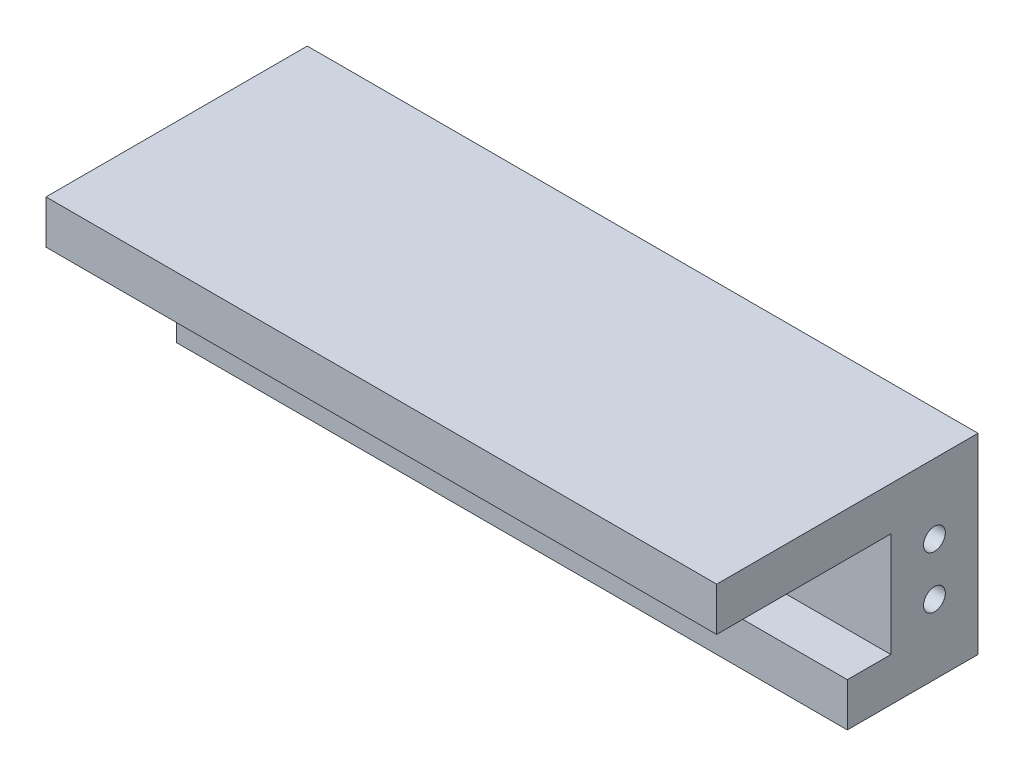
ISO-10303-21;
HEADER;
FILE_DESCRIPTION(('STEP AP214'),'2;1');
FILE_NAME('part.step','',(''),(''),'','','');
FILE_SCHEMA(('AUTOMOTIVE_DESIGN { 1 0 10303 214 1 1 1 1 }'));
ENDSEC;
DATA;
#1=APPLICATION_CONTEXT('core data for automotive mechanical design processes');
#2=APPLICATION_PROTOCOL_DEFINITION('international standard','automotive_design',2000,#1);
#3=PRODUCT_CONTEXT('',#1,'mechanical');
#4=PRODUCT('Part','Part','',(#3));
#5=PRODUCT_RELATED_PRODUCT_CATEGORY('part','',(#4));
#6=PRODUCT_DEFINITION_FORMATION('','',#4);
#7=PRODUCT_DEFINITION_CONTEXT('part definition',#1,'design');
#8=PRODUCT_DEFINITION('design','',#6,#7);
#9=PRODUCT_DEFINITION_SHAPE('','',#8);
#10=(LENGTH_UNIT() NAMED_UNIT(*) SI_UNIT(.MILLI.,.METRE.));
#11=(NAMED_UNIT(*) PLANE_ANGLE_UNIT() SI_UNIT($,.RADIAN.));
#12=(NAMED_UNIT(*) SI_UNIT($,.STERADIAN.) SOLID_ANGLE_UNIT());
#13=UNCERTAINTY_MEASURE_WITH_UNIT(LENGTH_MEASURE(1.E-05),#10,'distance_accuracy_value','');
#14=(GEOMETRIC_REPRESENTATION_CONTEXT(3) GLOBAL_UNCERTAINTY_ASSIGNED_CONTEXT((#13)) GLOBAL_UNIT_ASSIGNED_CONTEXT((#10,
#11,#12)) REPRESENTATION_CONTEXT('',''));
#15=CARTESIAN_POINT('',(0.,0.,0.));
#16=DIRECTION('',(0.,0.,1.));
#17=DIRECTION('',(1.,0.,0.));
#18=AXIS2_PLACEMENT_3D('',#15,#16,#17);
#19=CARTESIAN_POINT('',(0.,0.,10.));
#20=DIRECTION('',(1.,0.,0.));
#21=DIRECTION('',(0.,0.,-1.));
#22=AXIS2_PLACEMENT_3D('',#19,#20,#21);
#23=PLANE('',#22);
#24=CARTESIAN_POINT('',(0.,6.,5.));
#25=DIRECTION('',(-1.,0.,0.));
#26=DIRECTION('',(0.,0.,1.));
#27=AXIS2_PLACEMENT_3D('',#24,#25,#26);
#28=CIRCLE('',#27,1.25);
#29=CARTESIAN_POINT('',(0.,6.,6.25));
#30=VERTEX_POINT('',#29);
#31=EDGE_CURVE('E155',#30,#30,#28,.T.);
#32=ORIENTED_EDGE('',*,*,#31,.F.);
#33=EDGE_LOOP('',(#32));
#34=FACE_BOUND('',#33,.T.);
#35=DIRECTION('',(0.,-1.,0.));
#36=VECTOR('',#35,1.);
#37=CARTESIAN_POINT('',(0.,0.,15.));
#38=LINE('',#37,#36);
#39=CARTESIAN_POINT('',(0.,0.,15.));
#40=VERTEX_POINT('',#39);
#41=CARTESIAN_POINT('',(0.,-5.,15.));
#42=VERTEX_POINT('',#41);
#43=EDGE_CURVE('E49',#40,#42,#38,.T.);
#44=ORIENTED_EDGE('',*,*,#43,.F.);
#45=DIRECTION('',(0.,0.,1.));
#46=VECTOR('',#45,1.);
#47=CARTESIAN_POINT('',(0.,0.,0.));
#48=LINE('',#47,#46);
#49=CARTESIAN_POINT('',(0.,0.,10.));
#50=VERTEX_POINT('',#49);
#51=EDGE_CURVE('E196',#50,#40,#48,.T.);
#52=ORIENTED_EDGE('',*,*,#51,.F.);
#53=DIRECTION('',(0.,-1.,0.));
#54=VECTOR('',#53,1.);
#55=CARTESIAN_POINT('',(0.,0.,10.));
#56=LINE('',#55,#54);
#57=CARTESIAN_POINT('',(0.,12.,10.));
#58=VERTEX_POINT('',#57);
#59=EDGE_CURVE('E223',#58,#50,#56,.T.);
#60=ORIENTED_EDGE('',*,*,#59,.F.);
#61=DIRECTION('',(0.,0.,1.));
#62=VECTOR('',#61,1.);
#63=CARTESIAN_POINT('',(0.,12.,0.));
#64=LINE('',#63,#62);
#65=CARTESIAN_POINT('',(0.,12.,30.));
#66=VERTEX_POINT('',#65);
#67=EDGE_CURVE('E135',#58,#66,#64,.T.);
#68=ORIENTED_EDGE('',*,*,#67,.T.);
#69=DIRECTION('',(0.,-1.,0.));
#70=VECTOR('',#69,1.);
#71=CARTESIAN_POINT('',(0.,12.,30.));
#72=LINE('',#71,#70);
#73=CARTESIAN_POINT('',(0.,17.,30.));
#74=VERTEX_POINT('',#73);
#75=EDGE_CURVE('E145',#74,#66,#72,.T.);
#76=ORIENTED_EDGE('',*,*,#75,.F.);
#77=DIRECTION('',(0.,0.,1.));
#78=VECTOR('',#77,1.);
#79=CARTESIAN_POINT('',(0.,17.,0.));
#80=LINE('',#79,#78);
#81=CARTESIAN_POINT('',(0.,17.,0.));
#82=VERTEX_POINT('',#81);
#83=EDGE_CURVE('E141',#82,#74,#80,.T.);
#84=ORIENTED_EDGE('',*,*,#83,.F.);
#85=DIRECTION('',(0.,-1.,0.));
#86=VECTOR('',#85,1.);
#87=CARTESIAN_POINT('',(0.,0.,0.));
#88=LINE('',#87,#86);
#89=CARTESIAN_POINT('',(0.,-5.,0.));
#90=VERTEX_POINT('',#89);
#91=EDGE_CURVE('E214',#82,#90,#88,.T.);
#92=ORIENTED_EDGE('',*,*,#91,.T.);
#93=DIRECTION('',(0.,0.,1.));
#94=VECTOR('',#93,1.);
#95=CARTESIAN_POINT('',(0.,-5.,0.));
#96=LINE('',#95,#94);
#97=EDGE_CURVE('E195',#90,#42,#96,.T.);
#98=ORIENTED_EDGE('',*,*,#97,.T.);
#99=EDGE_LOOP('',(#44,#52,#60,#68,#76,#84,#92,#98));
#100=FACE_BOUND('',#99,.T.);
#101=ADVANCED_FACE('F33',(#34,#100),#23,.F.);
#102=CARTESIAN_POINT('',(77.,0.,10.));
#103=DIRECTION('',(-1.,0.,0.));
#104=DIRECTION('',(0.,0.,1.));
#105=AXIS2_PLACEMENT_3D('',#102,#103,#104);
#106=PLANE('',#105);
#107=CARTESIAN_POINT('',(77.,9.,5.));
#108=DIRECTION('',(1.,0.,0.));
#109=DIRECTION('',(0.,0.,-1.));
#110=AXIS2_PLACEMENT_3D('',#107,#108,#109);
#111=CIRCLE('',#110,1.25);
#112=CARTESIAN_POINT('',(77.,9.,3.75));
#113=VERTEX_POINT('',#112);
#114=EDGE_CURVE('E218',#113,#113,#111,.T.);
#115=ORIENTED_EDGE('',*,*,#114,.F.);
#116=EDGE_LOOP('',(#115));
#117=FACE_BOUND('',#116,.T.);
#118=CARTESIAN_POINT('',(77.,3.,5.));
#119=DIRECTION('',(1.,0.,0.));
#120=DIRECTION('',(0.,0.,-1.));
#121=AXIS2_PLACEMENT_3D('',#118,#119,#120);
#122=CIRCLE('',#121,1.25);
#123=CARTESIAN_POINT('',(77.,3.,3.75));
#124=VERTEX_POINT('',#123);
#125=EDGE_CURVE('E215',#124,#124,#122,.T.);
#126=ORIENTED_EDGE('',*,*,#125,.F.);
#127=EDGE_LOOP('',(#126));
#128=FACE_BOUND('',#127,.T.);
#129=DIRECTION('',(0.,1.,0.));
#130=VECTOR('',#129,1.);
#131=CARTESIAN_POINT('',(77.,0.,15.));
#132=LINE('',#131,#130);
#133=CARTESIAN_POINT('',(77.,-5.,15.));
#134=VERTEX_POINT('',#133);
#135=CARTESIAN_POINT('',(77.,0.,15.));
#136=VERTEX_POINT('',#135);
#137=EDGE_CURVE('E164',#134,#136,#132,.T.);
#138=ORIENTED_EDGE('',*,*,#137,.F.);
#139=DIRECTION('',(0.,0.,-1.));
#140=VECTOR('',#139,1.);
#141=CARTESIAN_POINT('',(77.,-5.,0.));
#142=LINE('',#141,#140);
#143=CARTESIAN_POINT('',(77.,-5.,0.));
#144=VERTEX_POINT('',#143);
#145=EDGE_CURVE('E193',#134,#144,#142,.T.);
#146=ORIENTED_EDGE('',*,*,#145,.T.);
#147=DIRECTION('',(0.,1.,0.));
#148=VECTOR('',#147,1.);
#149=CARTESIAN_POINT('',(77.,0.,0.));
#150=LINE('',#149,#148);
#151=CARTESIAN_POINT('',(77.,17.,0.));
#152=VERTEX_POINT('',#151);
#153=EDGE_CURVE('E36',#144,#152,#150,.T.);
#154=ORIENTED_EDGE('',*,*,#153,.T.);
#155=DIRECTION('',(0.,0.,-1.));
#156=VECTOR('',#155,1.);
#157=CARTESIAN_POINT('',(77.,17.,0.));
#158=LINE('',#157,#156);
#159=CARTESIAN_POINT('',(77.,17.,30.));
#160=VERTEX_POINT('',#159);
#161=EDGE_CURVE('E123',#160,#152,#158,.T.);
#162=ORIENTED_EDGE('',*,*,#161,.F.);
#163=DIRECTION('',(0.,1.,0.));
#164=VECTOR('',#163,1.);
#165=CARTESIAN_POINT('',(77.,12.,30.));
#166=LINE('',#165,#164);
#167=CARTESIAN_POINT('',(77.,12.,30.));
#168=VERTEX_POINT('',#167);
#169=EDGE_CURVE('E129',#168,#160,#166,.T.);
#170=ORIENTED_EDGE('',*,*,#169,.F.);
#171=DIRECTION('',(0.,0.,-1.));
#172=VECTOR('',#171,1.);
#173=CARTESIAN_POINT('',(77.,12.,0.));
#174=LINE('',#173,#172);
#175=CARTESIAN_POINT('',(77.,12.,10.));
#176=VERTEX_POINT('',#175);
#177=EDGE_CURVE('E202',#168,#176,#174,.T.);
#178=ORIENTED_EDGE('',*,*,#177,.T.);
#179=DIRECTION('',(0.,1.,0.));
#180=VECTOR('',#179,1.);
#181=CARTESIAN_POINT('',(77.,0.,10.));
#182=LINE('',#181,#180);
#183=CARTESIAN_POINT('',(77.,0.,10.));
#184=VERTEX_POINT('',#183);
#185=EDGE_CURVE('E230',#184,#176,#182,.T.);
#186=ORIENTED_EDGE('',*,*,#185,.F.);
#187=DIRECTION('',(0.,0.,-1.));
#188=VECTOR('',#187,1.);
#189=CARTESIAN_POINT('',(77.,0.,0.));
#190=LINE('',#189,#188);
#191=EDGE_CURVE('E187',#136,#184,#190,.T.);
#192=ORIENTED_EDGE('',*,*,#191,.F.);
#193=EDGE_LOOP('',(#138,#146,#154,#162,#170,#178,#186,#192));
#194=FACE_BOUND('',#193,.T.);
#195=ADVANCED_FACE('F126',(#117,#128,#194),#106,.F.);
#196=CARTESIAN_POINT('',(0.,0.,0.));
#197=DIRECTION('',(0.,1.,0.));
#198=DIRECTION('',(1.,0.,0.));
#199=AXIS2_PLACEMENT_3D('',#196,#197,#198);
#200=PLANE('',#199);
#201=ORIENTED_EDGE('',*,*,#51,.T.);
#202=DIRECTION('',(-1.,0.,0.));
#203=VECTOR('',#202,1.);
#204=CARTESIAN_POINT('',(0.,0.,15.));
#205=LINE('',#204,#203);
#206=EDGE_CURVE('E166',#136,#40,#205,.T.);
#207=ORIENTED_EDGE('',*,*,#206,.F.);
#208=ORIENTED_EDGE('',*,*,#191,.T.);
#209=DIRECTION('',(1.,0.,0.));
#210=VECTOR('',#209,1.);
#211=CARTESIAN_POINT('',(0.,0.,10.));
#212=LINE('',#211,#210);
#213=CARTESIAN_POINT('',(53.5,0.,10.));
#214=VERTEX_POINT('',#213);
#215=EDGE_CURVE('E226',#214,#184,#212,.T.);
#216=ORIENTED_EDGE('',*,*,#215,.F.);
#217=DIRECTION('',(0.,0.,-1.));
#218=VECTOR('',#217,1.);
#219=CARTESIAN_POINT('',(53.5,0.,10.));
#220=LINE('',#219,#218);
#221=CARTESIAN_POINT('',(53.5,0.,0.));
#222=VERTEX_POINT('',#221);
#223=EDGE_CURVE('E188',#214,#222,#220,.T.);
#224=ORIENTED_EDGE('',*,*,#223,.T.);
#225=DIRECTION('',(-1.,0.,0.));
#226=VECTOR('',#225,1.);
#227=CARTESIAN_POINT('',(0.,0.,0.));
#228=LINE('',#227,#226);
#229=CARTESIAN_POINT('',(23.5,0.,0.));
#230=VERTEX_POINT('',#229);
#231=EDGE_CURVE('E172',#222,#230,#228,.T.);
#232=ORIENTED_EDGE('',*,*,#231,.T.);
#233=DIRECTION('',(0.,0.,-1.));
#234=VECTOR('',#233,1.);
#235=CARTESIAN_POINT('',(23.5,0.,10.));
#236=LINE('',#235,#234);
#237=CARTESIAN_POINT('',(23.5,0.,10.));
#238=VERTEX_POINT('',#237);
#239=EDGE_CURVE('E185',#238,#230,#236,.T.);
#240=ORIENTED_EDGE('',*,*,#239,.F.);
#241=EDGE_CURVE('E227',#50,#238,#212,.T.);
#242=ORIENTED_EDGE('',*,*,#241,.F.);
#243=EDGE_LOOP('',(#201,#207,#208,#216,#224,#232,#240,#242));
#244=FACE_BOUND('',#243,.T.);
#245=ADVANCED_FACE('F259',(#244),#200,.T.);
#246=CARTESIAN_POINT('',(0.,-5.,0.));
#247=DIRECTION('',(0.,1.,0.));
#248=DIRECTION('',(1.,0.,0.));
#249=AXIS2_PLACEMENT_3D('',#246,#247,#248);
#250=PLANE('',#249);
#251=DIRECTION('',(1.,0.,0.));
#252=VECTOR('',#251,1.);
#253=CARTESIAN_POINT('',(0.,-5.,15.));
#254=LINE('',#253,#252);
#255=EDGE_CURVE('E162',#42,#134,#254,.T.);
#256=ORIENTED_EDGE('',*,*,#255,.F.);
#257=ORIENTED_EDGE('',*,*,#97,.F.);
#258=DIRECTION('',(-1.,0.,0.));
#259=VECTOR('',#258,1.);
#260=CARTESIAN_POINT('',(77.,-5.,0.));
#261=LINE('',#260,#259);
#262=EDGE_CURVE('E199',#144,#90,#261,.T.);
#263=ORIENTED_EDGE('',*,*,#262,.F.);
#264=ORIENTED_EDGE('',*,*,#145,.F.);
#265=EDGE_LOOP('',(#256,#257,#263,#264));
#266=FACE_BOUND('',#265,.T.);
#267=ADVANCED_FACE('F237',(#266),#250,.F.);
#268=CARTESIAN_POINT('',(0.,0.,10.));
#269=DIRECTION('',(0.,0.,-1.));
#270=DIRECTION('',(-1.,0.,0.));
#271=AXIS2_PLACEMENT_3D('',#268,#269,#270);
#272=PLANE('',#271);
#273=DIRECTION('',(0.,-1.,0.));
#274=VECTOR('',#273,1.);
#275=CARTESIAN_POINT('',(23.5,0.,10.));
#276=LINE('',#275,#274);
#277=CARTESIAN_POINT('',(23.5,12.,10.));
#278=VERTEX_POINT('',#277);
#279=EDGE_CURVE('E168',#278,#238,#276,.T.);
#280=ORIENTED_EDGE('',*,*,#279,.F.);
#281=DIRECTION('',(-1.,0.,0.));
#282=VECTOR('',#281,1.);
#283=CARTESIAN_POINT('',(0.,12.,10.));
#284=LINE('',#283,#282);
#285=EDGE_CURVE('E41',#278,#58,#284,.T.);
#286=ORIENTED_EDGE('',*,*,#285,.T.);
#287=ORIENTED_EDGE('',*,*,#59,.T.);
#288=ORIENTED_EDGE('',*,*,#241,.T.);
#289=EDGE_LOOP('',(#280,#286,#287,#288));
#290=FACE_BOUND('',#289,.T.);
#291=ADVANCED_FACE('F243',(#290),#272,.F.);
#292=CARTESIAN_POINT('',(0.,0.,0.));
#293=DIRECTION('',(0.,0.,-1.));
#294=DIRECTION('',(-1.,0.,0.));
#295=AXIS2_PLACEMENT_3D('',#292,#293,#294);
#296=PLANE('',#295);
#297=ORIENTED_EDGE('',*,*,#91,.F.);
#298=DIRECTION('',(-1.,0.,0.));
#299=VECTOR('',#298,1.);
#300=CARTESIAN_POINT('',(77.,17.,0.));
#301=LINE('',#300,#299);
#302=EDGE_CURVE('E134',#152,#82,#301,.T.);
#303=ORIENTED_EDGE('',*,*,#302,.F.);
#304=ORIENTED_EDGE('',*,*,#153,.F.);
#305=ORIENTED_EDGE('',*,*,#262,.T.);
#306=EDGE_LOOP('',(#297,#303,#304,#305));
#307=FACE_BOUND('',#306,.T.);
#308=DIRECTION('',(-1.,0.,0.));
#309=VECTOR('',#308,1.);
#310=CARTESIAN_POINT('',(0.,12.,0.));
#311=LINE('',#310,#309);
#312=CARTESIAN_POINT('',(53.5,12.,0.));
#313=VERTEX_POINT('',#312);
#314=CARTESIAN_POINT('',(23.5,12.,0.));
#315=VERTEX_POINT('',#314);
#316=EDGE_CURVE('E177',#313,#315,#311,.T.);
#317=ORIENTED_EDGE('',*,*,#316,.T.);
#318=DIRECTION('',(0.,-1.,0.));
#319=VECTOR('',#318,1.);
#320=CARTESIAN_POINT('',(23.5,0.,0.));
#321=LINE('',#320,#319);
#322=EDGE_CURVE('E57',#315,#230,#321,.T.);
#323=ORIENTED_EDGE('',*,*,#322,.T.);
#324=ORIENTED_EDGE('',*,*,#231,.F.);
#325=DIRECTION('',(0.,-1.,0.));
#326=VECTOR('',#325,1.);
#327=CARTESIAN_POINT('',(53.5,0.,0.));
#328=LINE('',#327,#326);
#329=EDGE_CURVE('E180',#313,#222,#328,.T.);
#330=ORIENTED_EDGE('',*,*,#329,.F.);
#331=EDGE_LOOP('',(#317,#323,#324,#330));
#332=FACE_BOUND('',#331,.T.);
#333=ADVANCED_FACE('F239',(#307,#332),#296,.T.);
#334=CARTESIAN_POINT('',(53.5,12.,10.));
#335=VERTEX_POINT('',#334);
#336=EDGE_CURVE('E11',#176,#335,#284,.T.);
#337=ORIENTED_EDGE('',*,*,#336,.T.);
#338=DIRECTION('',(0.,-1.,0.));
#339=VECTOR('',#338,1.);
#340=CARTESIAN_POINT('',(53.5,0.,10.));
#341=LINE('',#340,#339);
#342=EDGE_CURVE('E171',#335,#214,#341,.T.);
#343=ORIENTED_EDGE('',*,*,#342,.T.);
#344=ORIENTED_EDGE('',*,*,#215,.T.);
#345=ORIENTED_EDGE('',*,*,#185,.T.);
#346=EDGE_LOOP('',(#337,#343,#344,#345));
#347=FACE_BOUND('',#346,.T.);
#348=ADVANCED_FACE('F242',(#347),#272,.F.);
#349=CARTESIAN_POINT('',(65.,9.,5.));
#350=DIRECTION('',(1.,0.,0.));
#351=DIRECTION('',(0.,0.,-1.));
#352=AXIS2_PLACEMENT_3D('',#349,#350,#351);
#353=CYLINDRICAL_SURFACE('',#352,1.25);
#354=CARTESIAN_POINT('',(65.,9.,5.));
#355=DIRECTION('',(1.,0.,0.));
#356=DIRECTION('',(0.,0.,-1.));
#357=AXIS2_PLACEMENT_3D('',#354,#355,#356);
#358=CIRCLE('',#357,1.25);
#359=CARTESIAN_POINT('',(65.,9.,3.75));
#360=VERTEX_POINT('',#359);
#361=EDGE_CURVE('E208',#360,#360,#358,.T.);
#362=ORIENTED_EDGE('',*,*,#361,.F.);
#363=EDGE_LOOP('',(#362));
#364=FACE_BOUND('',#363,.T.);
#365=ORIENTED_EDGE('',*,*,#114,.T.);
#366=EDGE_LOOP('',(#365));
#367=FACE_BOUND('',#366,.T.);
#368=ADVANCED_FACE('F297',(#364,#367),#353,.F.);
#369=CARTESIAN_POINT('',(65.,9.,5.));
#370=DIRECTION('',(1.,0.,0.));
#371=DIRECTION('',(0.,0.,-1.));
#372=AXIS2_PLACEMENT_3D('',#369,#370,#371);
#373=PLANE('',#372);
#374=ORIENTED_EDGE('',*,*,#361,.T.);
#375=EDGE_LOOP('',(#374));
#376=FACE_BOUND('',#375,.T.);
#377=ADVANCED_FACE('F298',(#376),#373,.T.);
#378=CARTESIAN_POINT('',(65.,3.,5.));
#379=DIRECTION('',(1.,0.,0.));
#380=DIRECTION('',(0.,0.,-1.));
#381=AXIS2_PLACEMENT_3D('',#378,#379,#380);
#382=CYLINDRICAL_SURFACE('',#381,1.25);
#383=CARTESIAN_POINT('',(65.,3.,5.));
#384=DIRECTION('',(1.,0.,0.));
#385=DIRECTION('',(0.,0.,-1.));
#386=AXIS2_PLACEMENT_3D('',#383,#384,#385);
#387=CIRCLE('',#386,1.25);
#388=CARTESIAN_POINT('',(65.,3.,3.75));
#389=VERTEX_POINT('',#388);
#390=EDGE_CURVE('E211',#389,#389,#387,.T.);
#391=ORIENTED_EDGE('',*,*,#390,.F.);
#392=EDGE_LOOP('',(#391));
#393=FACE_BOUND('',#392,.T.);
#394=ORIENTED_EDGE('',*,*,#125,.T.);
#395=EDGE_LOOP('',(#394));
#396=FACE_BOUND('',#395,.T.);
#397=ADVANCED_FACE('F301',(#393,#396),#382,.F.);
#398=CARTESIAN_POINT('',(65.,3.,5.));
#399=DIRECTION('',(1.,0.,0.));
#400=DIRECTION('',(0.,0.,-1.));
#401=AXIS2_PLACEMENT_3D('',#398,#399,#400);
#402=PLANE('',#401);
#403=ORIENTED_EDGE('',*,*,#390,.T.);
#404=EDGE_LOOP('',(#403));
#405=FACE_BOUND('',#404,.T.);
#406=ADVANCED_FACE('F308',(#405),#402,.T.);
#407=CARTESIAN_POINT('',(0.,12.,0.));
#408=DIRECTION('',(0.,-1.,0.));
#409=DIRECTION('',(1.,0.,0.));
#410=AXIS2_PLACEMENT_3D('',#407,#408,#409);
#411=PLANE('',#410);
#412=ORIENTED_EDGE('',*,*,#336,.F.);
#413=ORIENTED_EDGE('',*,*,#177,.F.);
#414=DIRECTION('',(1.,0.,0.));
#415=VECTOR('',#414,1.);
#416=CARTESIAN_POINT('',(77.,12.,30.));
#417=LINE('',#416,#415);
#418=EDGE_CURVE('E150',#66,#168,#417,.T.);
#419=ORIENTED_EDGE('',*,*,#418,.F.);
#420=ORIENTED_EDGE('',*,*,#67,.F.);
#421=ORIENTED_EDGE('',*,*,#285,.F.);
#422=DIRECTION('',(0.,0.,-1.));
#423=VECTOR('',#422,1.);
#424=CARTESIAN_POINT('',(23.5,12.,10.));
#425=LINE('',#424,#423);
#426=EDGE_CURVE('E175',#278,#315,#425,.T.);
#427=ORIENTED_EDGE('',*,*,#426,.T.);
#428=ORIENTED_EDGE('',*,*,#316,.F.);
#429=DIRECTION('',(0.,0.,-1.));
#430=VECTOR('',#429,1.);
#431=CARTESIAN_POINT('',(53.5,12.,10.));
#432=LINE('',#431,#430);
#433=EDGE_CURVE('E190',#335,#313,#432,.T.);
#434=ORIENTED_EDGE('',*,*,#433,.F.);
#435=EDGE_LOOP('',(#412,#413,#419,#420,#421,#427,#428,#434));
#436=FACE_BOUND('',#435,.T.);
#437=ADVANCED_FACE('F249',(#436),#411,.T.);
#438=CARTESIAN_POINT('',(0.,17.,0.));
#439=DIRECTION('',(0.,-1.,0.));
#440=DIRECTION('',(1.,0.,0.));
#441=AXIS2_PLACEMENT_3D('',#438,#439,#440);
#442=PLANE('',#441);
#443=ORIENTED_EDGE('',*,*,#161,.T.);
#444=ORIENTED_EDGE('',*,*,#302,.T.);
#445=ORIENTED_EDGE('',*,*,#83,.T.);
#446=DIRECTION('',(-1.,0.,0.));
#447=VECTOR('',#446,1.);
#448=CARTESIAN_POINT('',(77.,17.,30.));
#449=LINE('',#448,#447);
#450=EDGE_CURVE('E138',#160,#74,#449,.T.);
#451=ORIENTED_EDGE('',*,*,#450,.F.);
#452=EDGE_LOOP('',(#443,#444,#445,#451));
#453=FACE_BOUND('',#452,.T.);
#454=ADVANCED_FACE('F139',(#453),#442,.F.);
#455=CARTESIAN_POINT('',(23.5,0.,10.));
#456=DIRECTION('',(1.,0.,0.));
#457=DIRECTION('',(0.,1.,0.));
#458=AXIS2_PLACEMENT_3D('',#455,#456,#457);
#459=PLANE('',#458);
#460=ORIENTED_EDGE('',*,*,#322,.F.);
#461=ORIENTED_EDGE('',*,*,#426,.F.);
#462=ORIENTED_EDGE('',*,*,#279,.T.);
#463=ORIENTED_EDGE('',*,*,#239,.T.);
#464=EDGE_LOOP('',(#460,#461,#462,#463));
#465=FACE_BOUND('',#464,.T.);
#466=ADVANCED_FACE('F254',(#465),#459,.T.);
#467=CARTESIAN_POINT('',(53.5,0.,10.));
#468=DIRECTION('',(1.,0.,0.));
#469=DIRECTION('',(0.,0.,-1.));
#470=AXIS2_PLACEMENT_3D('',#467,#468,#469);
#471=PLANE('',#470);
#472=ORIENTED_EDGE('',*,*,#329,.T.);
#473=ORIENTED_EDGE('',*,*,#223,.F.);
#474=ORIENTED_EDGE('',*,*,#342,.F.);
#475=ORIENTED_EDGE('',*,*,#433,.T.);
#476=EDGE_LOOP('',(#472,#473,#474,#475));
#477=FACE_BOUND('',#476,.T.);
#478=ADVANCED_FACE('F269',(#477),#471,.F.);
#479=CARTESIAN_POINT('',(0.,0.,15.));
#480=DIRECTION('',(0.,0.,1.));
#481=DIRECTION('',(1.,0.,0.));
#482=AXIS2_PLACEMENT_3D('',#479,#480,#481);
#483=PLANE('',#482);
#484=ORIENTED_EDGE('',*,*,#43,.T.);
#485=ORIENTED_EDGE('',*,*,#255,.T.);
#486=ORIENTED_EDGE('',*,*,#137,.T.);
#487=ORIENTED_EDGE('',*,*,#206,.T.);
#488=EDGE_LOOP('',(#484,#485,#486,#487));
#489=FACE_BOUND('',#488,.T.);
#490=ADVANCED_FACE('F266',(#489),#483,.T.);
#491=CARTESIAN_POINT('',(12.,6.,5.));
#492=DIRECTION('',(-1.,0.,0.));
#493=DIRECTION('',(0.,0.,1.));
#494=AXIS2_PLACEMENT_3D('',#491,#492,#493);
#495=CYLINDRICAL_SURFACE('',#494,1.25);
#496=CARTESIAN_POINT('',(12.,6.,5.));
#497=DIRECTION('',(-1.,0.,0.));
#498=DIRECTION('',(0.,0.,1.));
#499=AXIS2_PLACEMENT_3D('',#496,#497,#498);
#500=CIRCLE('',#499,1.25);
#501=CARTESIAN_POINT('',(12.,6.,6.25));
#502=VERTEX_POINT('',#501);
#503=EDGE_CURVE('E156',#502,#502,#500,.T.);
#504=ORIENTED_EDGE('',*,*,#503,.F.);
#505=EDGE_LOOP('',(#504));
#506=FACE_BOUND('',#505,.T.);
#507=ORIENTED_EDGE('',*,*,#31,.T.);
#508=EDGE_LOOP('',(#507));
#509=FACE_BOUND('',#508,.T.);
#510=ADVANCED_FACE('F268',(#506,#509),#495,.F.);
#511=CARTESIAN_POINT('',(12.,0.,0.));
#512=DIRECTION('',(-1.,0.,0.));
#513=DIRECTION('',(0.,0.,1.));
#514=AXIS2_PLACEMENT_3D('',#511,#512,#513);
#515=PLANE('',#514);
#516=ORIENTED_EDGE('',*,*,#503,.T.);
#517=EDGE_LOOP('',(#516));
#518=FACE_BOUND('',#517,.T.);
#519=ADVANCED_FACE('F275',(#518),#515,.T.);
#520=CARTESIAN_POINT('',(0.,0.,30.));
#521=DIRECTION('',(0.,0.,1.));
#522=DIRECTION('',(1.,0.,0.));
#523=AXIS2_PLACEMENT_3D('',#520,#521,#522);
#524=PLANE('',#523);
#525=ORIENTED_EDGE('',*,*,#169,.T.);
#526=ORIENTED_EDGE('',*,*,#450,.T.);
#527=ORIENTED_EDGE('',*,*,#75,.T.);
#528=ORIENTED_EDGE('',*,*,#418,.T.);
#529=EDGE_LOOP('',(#525,#526,#527,#528));
#530=FACE_BOUND('',#529,.T.);
#531=ADVANCED_FACE('F148',(#530),#524,.T.);
#532=CLOSED_SHELL('',(#101,#195,#245,#267,#291,#333,#348,#368,#377,#397,#406,#437,#454,#466,
#478,#490,#510,#519,#531));
#533=MANIFOLD_SOLID_BREP('B2',#532);
#534=ADVANCED_BREP_SHAPE_REPRESENTATION('',(#18,#533),#14);
#535=SHAPE_DEFINITION_REPRESENTATION(#9,#534);
ENDSEC;
END-ISO-10303-21;
